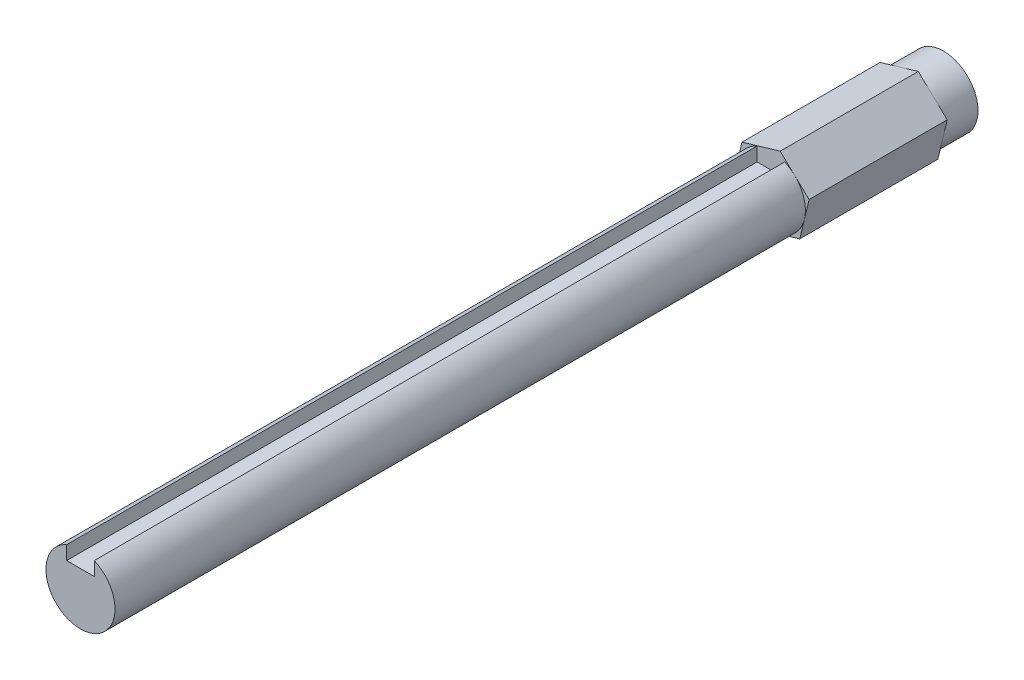
ISO-10303-21;
HEADER;
FILE_DESCRIPTION(('STEP AP214'),'2;1');
FILE_NAME('part.step','',(''),(''),'','','');
FILE_SCHEMA(('AUTOMOTIVE_DESIGN { 1 0 10303 214 1 1 1 1 }'));
ENDSEC;
DATA;
#1=APPLICATION_CONTEXT('core data for automotive mechanical design processes');
#2=APPLICATION_PROTOCOL_DEFINITION('international standard','automotive_design',2000,#1);
#3=PRODUCT_CONTEXT('',#1,'mechanical');
#4=PRODUCT('Part','Part','',(#3));
#5=PRODUCT_RELATED_PRODUCT_CATEGORY('part','',(#4));
#6=PRODUCT_DEFINITION_FORMATION('','',#4);
#7=PRODUCT_DEFINITION_CONTEXT('part definition',#1,'design');
#8=PRODUCT_DEFINITION('design','',#6,#7);
#9=PRODUCT_DEFINITION_SHAPE('','',#8);
#10=(LENGTH_UNIT() NAMED_UNIT(*) SI_UNIT(.MILLI.,.METRE.));
#11=(NAMED_UNIT(*) PLANE_ANGLE_UNIT() SI_UNIT($,.RADIAN.));
#12=(NAMED_UNIT(*) SI_UNIT($,.STERADIAN.) SOLID_ANGLE_UNIT());
#13=UNCERTAINTY_MEASURE_WITH_UNIT(LENGTH_MEASURE(1.E-05),#10,'distance_accuracy_value','');
#14=(GEOMETRIC_REPRESENTATION_CONTEXT(3) GLOBAL_UNCERTAINTY_ASSIGNED_CONTEXT((#13)) GLOBAL_UNIT_ASSIGNED_CONTEXT((#10,
#11,#12)) REPRESENTATION_CONTEXT('',''));
#15=CARTESIAN_POINT('',(0.,0.,0.));
#16=DIRECTION('',(0.,0.,1.));
#17=DIRECTION('',(1.,0.,0.));
#18=AXIS2_PLACEMENT_3D('',#15,#16,#17);
#19=CARTESIAN_POINT('',(0.,0.,20.));
#20=DIRECTION('',(0.,0.,1.));
#21=DIRECTION('',(1.,0.,0.));
#22=AXIS2_PLACEMENT_3D('',#19,#20,#21);
#23=PLANE('',#22);
#24=CARTESIAN_POINT('',(0.,0.,20.));
#25=DIRECTION('',(0.,0.,1.));
#26=DIRECTION('',(1.,0.,0.));
#27=AXIS2_PLACEMENT_3D('',#24,#25,#26);
#28=CIRCLE('',#27,4.99999999999998);
#29=CARTESIAN_POINT('',(-2.,4.58257569495582,20.));
#30=VERTEX_POINT('',#29);
#31=CARTESIAN_POINT('',(-4.8615327041477,1.16854600529981,20.));
#32=VERTEX_POINT('',#31);
#33=EDGE_CURVE('E43',#30,#32,#28,.T.);
#34=ORIENTED_EDGE('',*,*,#33,.F.);
#35=DIRECTION('',(0.,-1.,0.));
#36=VECTOR('',#35,1.);
#37=CARTESIAN_POINT('',(-2.,2.58257569495582,20.));
#38=LINE('',#37,#36);
#39=CARTESIAN_POINT('',(-2.,2.58257569495582,20.));
#40=VERTEX_POINT('',#39);
#41=EDGE_CURVE('E145',#30,#40,#38,.T.);
#42=ORIENTED_EDGE('',*,*,#41,.T.);
#43=DIRECTION('',(1.,0.,0.));
#44=VECTOR('',#43,1.);
#45=CARTESIAN_POINT('',(2.,2.58257569495582,20.));
#46=LINE('',#45,#44);
#47=CARTESIAN_POINT('',(2.,2.58257569495582,20.));
#48=VERTEX_POINT('',#47);
#49=EDGE_CURVE('E149',#40,#48,#46,.T.);
#50=ORIENTED_EDGE('',*,*,#49,.T.);
#51=DIRECTION('',(0.,1.,0.));
#52=VECTOR('',#51,1.);
#53=CARTESIAN_POINT('',(2.,2.58257569495582,20.));
#54=LINE('',#53,#52);
#55=CARTESIAN_POINT('',(2.,4.58257569495582,20.));
#56=VERTEX_POINT('',#55);
#57=EDGE_CURVE('E161',#48,#56,#54,.T.);
#58=ORIENTED_EDGE('',*,*,#57,.T.);
#59=CARTESIAN_POINT('',(3.44275687815431,3.62593782047086,20.));
#60=VERTEX_POINT('',#59);
#61=EDGE_CURVE('E175',#60,#56,#28,.T.);
#62=ORIENTED_EDGE('',*,*,#61,.F.);
#63=DIRECTION('',(-0.725187564094175,0.688551375630865,0.));
#64=VECTOR('',#63,1.);
#65=CARTESIAN_POINT('',(5.53619305486802,1.63826121011403,20.));
#66=LINE('',#65,#64);
#67=CARTESIAN_POINT('',(1.34932070144062,5.6136144308277,20.));
#68=VERTEX_POINT('',#67);
#69=EDGE_CURVE('E193',#60,#68,#66,.T.);
#70=ORIENTED_EDGE('',*,*,#69,.T.);
#71=DIRECTION('',(-0.958896765154138,-0.283755165198678,0.));
#72=VECTOR('',#71,1.);
#73=CARTESIAN_POINT('',(1.34932070144062,5.6136144308277,20.));
#74=LINE('',#73,#72);
#75=CARTESIAN_POINT('',(-4.18687235342739,3.97535322071367,20.));
#76=VERTEX_POINT('',#75);
#77=EDGE_CURVE('E197',#68,#76,#74,.T.);
#78=ORIENTED_EDGE('',*,*,#77,.T.);
#79=DIRECTION('',(-0.233709201059963,-0.972306540829544,0.));
#80=VECTOR('',#79,1.);
#81=CARTESIAN_POINT('',(-4.18687235342739,3.97535322071367,20.));
#82=LINE('',#81,#80);
#83=EDGE_CURVE('E200',#76,#32,#82,.T.);
#84=ORIENTED_EDGE('',*,*,#83,.T.);
#85=EDGE_LOOP('',(#34,#42,#50,#58,#62,#70,#78,#84));
#86=FACE_BOUND('',#85,.T.);
#87=ADVANCED_FACE('F35',(#86),#23,.T.);
#88=CARTESIAN_POINT('',(-3.44275687815431,-3.62593782047086,20.));
#89=VERTEX_POINT('',#88);
#90=EDGE_CURVE('E264',#32,#89,#28,.T.);
#91=ORIENTED_EDGE('',*,*,#90,.F.);
#92=CARTESIAN_POINT('',(-5.53619305486801,-1.63826121011403,20.));
#93=VERTEX_POINT('',#92);
#94=EDGE_CURVE('E199',#32,#93,#82,.T.);
#95=ORIENTED_EDGE('',*,*,#94,.T.);
#96=DIRECTION('',(0.725187564094175,-0.688551375630865,0.));
#97=VECTOR('',#96,1.);
#98=CARTESIAN_POINT('',(-5.53619305486801,-1.63826121011403,20.));
#99=LINE('',#98,#97);
#100=EDGE_CURVE('E203',#93,#89,#99,.T.);
#101=ORIENTED_EDGE('',*,*,#100,.T.);
#102=EDGE_LOOP('',(#91,#95,#101));
#103=FACE_BOUND('',#102,.T.);
#104=ADVANCED_FACE('F271',(#103),#23,.T.);
#105=CARTESIAN_POINT('',(1.41877582599339,-4.79448382577068,20.));
#106=VERTEX_POINT('',#105);
#107=EDGE_CURVE('E262',#89,#106,#28,.T.);
#108=ORIENTED_EDGE('',*,*,#107,.F.);
#109=CARTESIAN_POINT('',(-1.34932070144061,-5.6136144308277,20.));
#110=VERTEX_POINT('',#109);
#111=EDGE_CURVE('E202',#89,#110,#99,.T.);
#112=ORIENTED_EDGE('',*,*,#111,.T.);
#113=DIRECTION('',(0.958896765154138,0.283755165198678,0.));
#114=VECTOR('',#113,1.);
#115=CARTESIAN_POINT('',(-1.34932070144061,-5.6136144308277,20.));
#116=LINE('',#115,#114);
#117=EDGE_CURVE('E207',#110,#106,#116,.T.);
#118=ORIENTED_EDGE('',*,*,#117,.T.);
#119=EDGE_LOOP('',(#108,#112,#118));
#120=FACE_BOUND('',#119,.T.);
#121=ADVANCED_FACE('F312',(#120),#23,.T.);
#122=CARTESIAN_POINT('',(4.86153270414771,-1.16854600529982,20.));
#123=VERTEX_POINT('',#122);
#124=EDGE_CURVE('E57',#106,#123,#28,.T.);
#125=ORIENTED_EDGE('',*,*,#124,.F.);
#126=CARTESIAN_POINT('',(4.18687235342739,-3.97535322071367,20.));
#127=VERTEX_POINT('',#126);
#128=EDGE_CURVE('E206',#106,#127,#116,.T.);
#129=ORIENTED_EDGE('',*,*,#128,.T.);
#130=DIRECTION('',(0.233709201059964,0.972306540829544,0.));
#131=VECTOR('',#130,1.);
#132=CARTESIAN_POINT('',(4.18687235342739,-3.97535322071367,20.));
#133=LINE('',#132,#131);
#134=EDGE_CURVE('E191',#127,#123,#133,.T.);
#135=ORIENTED_EDGE('',*,*,#134,.T.);
#136=EDGE_LOOP('',(#125,#129,#135));
#137=FACE_BOUND('',#136,.T.);
#138=ADVANCED_FACE('F316',(#137),#23,.T.);
#139=CARTESIAN_POINT('',(0.,0.,0.));
#140=DIRECTION('',(0.,0.,1.));
#141=DIRECTION('',(1.,0.,0.));
#142=AXIS2_PLACEMENT_3D('',#139,#140,#141);
#143=PLANE('',#142);
#144=CARTESIAN_POINT('',(0.,0.,0.));
#145=DIRECTION('',(0.,0.,-1.));
#146=DIRECTION('',(-1.,0.,0.));
#147=AXIS2_PLACEMENT_3D('',#144,#145,#146);
#148=CIRCLE('',#147,4.99999999999998);
#149=CARTESIAN_POINT('',(-4.8615327041477,1.16854600529981,0.));
#150=VERTEX_POINT('',#149);
#151=CARTESIAN_POINT('',(-1.41877582599339,4.79448382577068,0.));
#152=VERTEX_POINT('',#151);
#153=EDGE_CURVE('E179',#150,#152,#148,.T.);
#154=ORIENTED_EDGE('',*,*,#153,.F.);
#155=DIRECTION('',(-0.233709201059963,-0.972306540829544,0.));
#156=VECTOR('',#155,1.);
#157=CARTESIAN_POINT('',(-4.18687235342739,3.97535322071367,0.));
#158=LINE('',#157,#156);
#159=CARTESIAN_POINT('',(-4.18687235342739,3.97535322071367,0.));
#160=VERTEX_POINT('',#159);
#161=EDGE_CURVE('E223',#160,#150,#158,.T.);
#162=ORIENTED_EDGE('',*,*,#161,.F.);
#163=DIRECTION('',(-0.958896765154138,-0.283755165198678,0.));
#164=VECTOR('',#163,1.);
#165=CARTESIAN_POINT('',(1.34932070144062,5.6136144308277,0.));
#166=LINE('',#165,#164);
#167=EDGE_CURVE('E218',#152,#160,#166,.T.);
#168=ORIENTED_EDGE('',*,*,#167,.F.);
#169=EDGE_LOOP('',(#154,#162,#168));
#170=FACE_BOUND('',#169,.T.);
#171=ADVANCED_FACE('F289',(#170),#143,.F.);
#172=CARTESIAN_POINT('',(3.44275687815432,3.62593782047086,0.));
#173=VERTEX_POINT('',#172);
#174=EDGE_CURVE('E189',#152,#173,#148,.T.);
#175=ORIENTED_EDGE('',*,*,#174,.F.);
#176=CARTESIAN_POINT('',(1.34932070144062,5.6136144308277,0.));
#177=VERTEX_POINT('',#176);
#178=EDGE_CURVE('E219',#177,#152,#166,.T.);
#179=ORIENTED_EDGE('',*,*,#178,.F.);
#180=DIRECTION('',(-0.725187564094175,0.688551375630865,0.));
#181=VECTOR('',#180,1.);
#182=CARTESIAN_POINT('',(5.53619305486802,1.63826121011403,0.));
#183=LINE('',#182,#181);
#184=EDGE_CURVE('E214',#173,#177,#183,.T.);
#185=ORIENTED_EDGE('',*,*,#184,.F.);
#186=EDGE_LOOP('',(#175,#179,#185));
#187=FACE_BOUND('',#186,.T.);
#188=ADVANCED_FACE('F328',(#187),#143,.F.);
#189=CARTESIAN_POINT('',(4.86153270414771,-1.16854600529982,0.));
#190=VERTEX_POINT('',#189);
#191=EDGE_CURVE('E257',#173,#190,#148,.T.);
#192=ORIENTED_EDGE('',*,*,#191,.F.);
#193=CARTESIAN_POINT('',(5.53619305486802,1.63826121011403,0.));
#194=VERTEX_POINT('',#193);
#195=EDGE_CURVE('E215',#194,#173,#183,.T.);
#196=ORIENTED_EDGE('',*,*,#195,.F.);
#197=DIRECTION('',(0.233709201059964,0.972306540829544,0.));
#198=VECTOR('',#197,1.);
#199=CARTESIAN_POINT('',(4.18687235342739,-3.97535322071367,0.));
#200=LINE('',#199,#198);
#201=EDGE_CURVE('E186',#190,#194,#200,.T.);
#202=ORIENTED_EDGE('',*,*,#201,.F.);
#203=EDGE_LOOP('',(#192,#196,#202));
#204=FACE_BOUND('',#203,.T.);
#205=ADVANCED_FACE('F458',(#204),#143,.F.);
#206=CARTESIAN_POINT('',(1.41877582599339,-4.79448382577068,0.));
#207=VERTEX_POINT('',#206);
#208=EDGE_CURVE('E255',#190,#207,#148,.T.);
#209=ORIENTED_EDGE('',*,*,#208,.F.);
#210=CARTESIAN_POINT('',(4.18687235342739,-3.97535322071367,0.));
#211=VERTEX_POINT('',#210);
#212=EDGE_CURVE('E211',#211,#190,#200,.T.);
#213=ORIENTED_EDGE('',*,*,#212,.F.);
#214=DIRECTION('',(0.958896765154138,0.283755165198678,0.));
#215=VECTOR('',#214,1.);
#216=CARTESIAN_POINT('',(-1.34932070144061,-5.6136144308277,0.));
#217=LINE('',#216,#215);
#218=EDGE_CURVE('E229',#207,#211,#217,.T.);
#219=ORIENTED_EDGE('',*,*,#218,.F.);
#220=EDGE_LOOP('',(#209,#213,#219));
#221=FACE_BOUND('',#220,.T.);
#222=ADVANCED_FACE('F450',(#221),#143,.F.);
#223=CARTESIAN_POINT('',(-3.44275687815431,-3.62593782047086,0.));
#224=VERTEX_POINT('',#223);
#225=EDGE_CURVE('E252',#207,#224,#148,.T.);
#226=ORIENTED_EDGE('',*,*,#225,.F.);
#227=CARTESIAN_POINT('',(-1.34932070144061,-5.6136144308277,0.));
#228=VERTEX_POINT('',#227);
#229=EDGE_CURVE('E230',#228,#207,#217,.T.);
#230=ORIENTED_EDGE('',*,*,#229,.F.);
#231=DIRECTION('',(0.725187564094175,-0.688551375630865,0.));
#232=VECTOR('',#231,1.);
#233=CARTESIAN_POINT('',(-5.53619305486801,-1.63826121011403,0.));
#234=LINE('',#233,#232);
#235=EDGE_CURVE('E225',#224,#228,#234,.T.);
#236=ORIENTED_EDGE('',*,*,#235,.F.);
#237=EDGE_LOOP('',(#226,#230,#236));
#238=FACE_BOUND('',#237,.T.);
#239=ADVANCED_FACE('F305',(#238),#143,.F.);
#240=CARTESIAN_POINT('',(4.18687235342739,-3.97535322071367,20.));
#241=DIRECTION('',(-0.972306540829544,0.233709201059964,0.));
#242=DIRECTION('',(-0.233709201059964,-0.972306540829544,0.));
#243=AXIS2_PLACEMENT_3D('',#240,#241,#242);
#244=PLANE('',#243);
#245=ORIENTED_EDGE('',*,*,#212,.T.);
#246=ORIENTED_EDGE('',*,*,#201,.T.);
#247=DIRECTION('',(0.,0.,-1.));
#248=VECTOR('',#247,1.);
#249=CARTESIAN_POINT('',(5.53619305486802,1.63826121011403,20.));
#250=LINE('',#249,#248);
#251=CARTESIAN_POINT('',(5.53619305486802,1.63826121011403,20.));
#252=VERTEX_POINT('',#251);
#253=EDGE_CURVE('E246',#252,#194,#250,.T.);
#254=ORIENTED_EDGE('',*,*,#253,.F.);
#255=EDGE_CURVE('E194',#123,#252,#133,.T.);
#256=ORIENTED_EDGE('',*,*,#255,.F.);
#257=ORIENTED_EDGE('',*,*,#134,.F.);
#258=DIRECTION('',(0.,0.,-1.));
#259=VECTOR('',#258,1.);
#260=CARTESIAN_POINT('',(4.18687235342739,-3.97535322071367,20.));
#261=LINE('',#260,#259);
#262=EDGE_CURVE('E210',#127,#211,#261,.T.);
#263=ORIENTED_EDGE('',*,*,#262,.T.);
#264=EDGE_LOOP('',(#245,#246,#254,#256,#257,#263));
#265=FACE_BOUND('',#264,.T.);
#266=ADVANCED_FACE('F37',(#265),#244,.F.);
#267=CARTESIAN_POINT('',(5.53619305486802,1.63826121011403,20.));
#268=DIRECTION('',(-0.688551375630865,-0.725187564094175,0.));
#269=DIRECTION('',(0.725187564094175,-0.688551375630866,0.));
#270=AXIS2_PLACEMENT_3D('',#267,#268,#269);
#271=PLANE('',#270);
#272=ORIENTED_EDGE('',*,*,#195,.T.);
#273=ORIENTED_EDGE('',*,*,#184,.T.);
#274=DIRECTION('',(0.,0.,-1.));
#275=VECTOR('',#274,1.);
#276=CARTESIAN_POINT('',(1.34932070144062,5.6136144308277,20.));
#277=LINE('',#276,#275);
#278=EDGE_CURVE('E244',#68,#177,#277,.T.);
#279=ORIENTED_EDGE('',*,*,#278,.F.);
#280=ORIENTED_EDGE('',*,*,#69,.F.);
#281=EDGE_CURVE('E195',#252,#60,#66,.T.);
#282=ORIENTED_EDGE('',*,*,#281,.F.);
#283=ORIENTED_EDGE('',*,*,#253,.T.);
#284=EDGE_LOOP('',(#272,#273,#279,#280,#282,#283));
#285=FACE_BOUND('',#284,.T.);
#286=ADVANCED_FACE('F343',(#285),#271,.F.);
#287=CARTESIAN_POINT('',(1.34932070144062,5.6136144308277,20.));
#288=DIRECTION('',(0.283755165198678,-0.958896765154139,0.));
#289=DIRECTION('',(0.958896765154139,0.283755165198678,0.));
#290=AXIS2_PLACEMENT_3D('',#287,#288,#289);
#291=PLANE('',#290);
#292=ORIENTED_EDGE('',*,*,#178,.T.);
#293=ORIENTED_EDGE('',*,*,#167,.T.);
#294=DIRECTION('',(0.,0.,-1.));
#295=VECTOR('',#294,1.);
#296=CARTESIAN_POINT('',(-4.18687235342739,3.97535322071367,20.));
#297=LINE('',#296,#295);
#298=EDGE_CURVE('E241',#76,#160,#297,.T.);
#299=ORIENTED_EDGE('',*,*,#298,.F.);
#300=ORIENTED_EDGE('',*,*,#77,.F.);
#301=ORIENTED_EDGE('',*,*,#278,.T.);
#302=EDGE_LOOP('',(#292,#293,#299,#300,#301));
#303=FACE_BOUND('',#302,.T.);
#304=ADVANCED_FACE('F283',(#303),#291,.F.);
#305=CARTESIAN_POINT('',(-4.18687235342739,3.97535322071367,20.));
#306=DIRECTION('',(0.972306540829544,-0.233709201059963,0.));
#307=DIRECTION('',(0.233709201059964,0.972306540829544,0.));
#308=AXIS2_PLACEMENT_3D('',#305,#306,#307);
#309=PLANE('',#308);
#310=ORIENTED_EDGE('',*,*,#161,.T.);
#311=CARTESIAN_POINT('',(-5.53619305486801,-1.63826121011403,0.));
#312=VERTEX_POINT('',#311);
#313=EDGE_CURVE('E222',#150,#312,#158,.T.);
#314=ORIENTED_EDGE('',*,*,#313,.T.);
#315=DIRECTION('',(0.,0.,-1.));
#316=VECTOR('',#315,1.);
#317=CARTESIAN_POINT('',(-5.53619305486801,-1.63826121011403,20.));
#318=LINE('',#317,#316);
#319=EDGE_CURVE('E238',#93,#312,#318,.T.);
#320=ORIENTED_EDGE('',*,*,#319,.F.);
#321=ORIENTED_EDGE('',*,*,#94,.F.);
#322=ORIENTED_EDGE('',*,*,#83,.F.);
#323=ORIENTED_EDGE('',*,*,#298,.T.);
#324=EDGE_LOOP('',(#310,#314,#320,#321,#322,#323));
#325=FACE_BOUND('',#324,.T.);
#326=ADVANCED_FACE('F276',(#325),#309,.F.);
#327=CARTESIAN_POINT('',(-5.53619305486801,-1.63826121011403,20.));
#328=DIRECTION('',(0.688551375630865,0.725187564094175,0.));
#329=DIRECTION('',(-0.725187564094175,0.688551375630865,0.));
#330=AXIS2_PLACEMENT_3D('',#327,#328,#329);
#331=PLANE('',#330);
#332=EDGE_CURVE('E226',#312,#224,#234,.T.);
#333=ORIENTED_EDGE('',*,*,#332,.T.);
#334=ORIENTED_EDGE('',*,*,#235,.T.);
#335=DIRECTION('',(0.,0.,-1.));
#336=VECTOR('',#335,1.);
#337=CARTESIAN_POINT('',(-1.34932070144061,-5.6136144308277,20.));
#338=LINE('',#337,#336);
#339=EDGE_CURVE('E235',#110,#228,#338,.T.);
#340=ORIENTED_EDGE('',*,*,#339,.F.);
#341=ORIENTED_EDGE('',*,*,#111,.F.);
#342=ORIENTED_EDGE('',*,*,#100,.F.);
#343=ORIENTED_EDGE('',*,*,#319,.T.);
#344=EDGE_LOOP('',(#333,#334,#340,#341,#342,#343));
#345=FACE_BOUND('',#344,.T.);
#346=ADVANCED_FACE('F320',(#345),#331,.F.);
#347=CARTESIAN_POINT('',(-1.34932070144061,-5.6136144308277,20.));
#348=DIRECTION('',(-0.283755165198678,0.958896765154138,0.));
#349=DIRECTION('',(-0.958896765154139,-0.283755165198678,0.));
#350=AXIS2_PLACEMENT_3D('',#347,#348,#349);
#351=PLANE('',#350);
#352=ORIENTED_EDGE('',*,*,#229,.T.);
#353=ORIENTED_EDGE('',*,*,#218,.T.);
#354=ORIENTED_EDGE('',*,*,#262,.F.);
#355=ORIENTED_EDGE('',*,*,#128,.F.);
#356=ORIENTED_EDGE('',*,*,#117,.F.);
#357=ORIENTED_EDGE('',*,*,#339,.T.);
#358=EDGE_LOOP('',(#352,#353,#354,#355,#356,#357));
#359=FACE_BOUND('',#358,.T.);
#360=ADVANCED_FACE('F314',(#359),#351,.F.);
#361=EDGE_CURVE('E182',#123,#60,#28,.T.);
#362=ORIENTED_EDGE('',*,*,#361,.F.);
#363=ORIENTED_EDGE('',*,*,#255,.T.);
#364=ORIENTED_EDGE('',*,*,#281,.T.);
#365=EDGE_LOOP('',(#362,#363,#364));
#366=FACE_BOUND('',#365,.T.);
#367=ADVANCED_FACE('F302',(#366),#23,.T.);
#368=EDGE_CURVE('E190',#224,#150,#148,.T.);
#369=ORIENTED_EDGE('',*,*,#368,.F.);
#370=ORIENTED_EDGE('',*,*,#332,.F.);
#371=ORIENTED_EDGE('',*,*,#313,.F.);
#372=EDGE_LOOP('',(#369,#370,#371));
#373=FACE_BOUND('',#372,.T.);
#374=ADVANCED_FACE('F293',(#373),#143,.F.);
#375=CARTESIAN_POINT('',(0.,0.,-5.));
#376=DIRECTION('',(0.,0.,1.));
#377=DIRECTION('',(1.,0.,0.));
#378=AXIS2_PLACEMENT_3D('',#375,#376,#377);
#379=CYLINDRICAL_SURFACE('',#378,4.99999999999998);
#380=CARTESIAN_POINT('',(0.,0.,-5.));
#381=DIRECTION('',(0.,0.,-1.));
#382=DIRECTION('',(-1.,0.,0.));
#383=AXIS2_PLACEMENT_3D('',#380,#381,#382);
#384=CIRCLE('',#383,4.99999999999998);
#385=CARTESIAN_POINT('',(-4.99999999999998,0.,-5.));
#386=VERTEX_POINT('',#385);
#387=EDGE_CURVE('E183',#386,#386,#384,.T.);
#388=ORIENTED_EDGE('',*,*,#387,.F.);
#389=EDGE_LOOP('',(#388));
#390=FACE_BOUND('',#389,.T.);
#391=ORIENTED_EDGE('',*,*,#153,.T.);
#392=ORIENTED_EDGE('',*,*,#174,.T.);
#393=ORIENTED_EDGE('',*,*,#191,.T.);
#394=ORIENTED_EDGE('',*,*,#208,.T.);
#395=ORIENTED_EDGE('',*,*,#225,.T.);
#396=ORIENTED_EDGE('',*,*,#368,.T.);
#397=EDGE_LOOP('',(#391,#392,#393,#394,#395,#396));
#398=FACE_BOUND('',#397,.T.);
#399=ADVANCED_FACE('F290',(#390,#398),#379,.T.);
#400=CARTESIAN_POINT('',(0.,0.,-5.));
#401=DIRECTION('',(0.,0.,-1.));
#402=DIRECTION('',(-1.,0.,0.));
#403=AXIS2_PLACEMENT_3D('',#400,#401,#402);
#404=PLANE('',#403);
#405=ORIENTED_EDGE('',*,*,#387,.T.);
#406=EDGE_LOOP('',(#405));
#407=FACE_BOUND('',#406,.T.);
#408=ADVANCED_FACE('F292',(#407),#404,.T.);
#409=CARTESIAN_POINT('',(0.,0.,120.));
#410=DIRECTION('',(0.,0.,-1.));
#411=DIRECTION('',(-1.,0.,0.));
#412=AXIS2_PLACEMENT_3D('',#409,#410,#411);
#413=CYLINDRICAL_SURFACE('',#412,4.99999999999998);
#414=ORIENTED_EDGE('',*,*,#61,.T.);
#415=DIRECTION('',(0.,0.,-1.));
#416=VECTOR('',#415,1.);
#417=CARTESIAN_POINT('',(2.,4.58257569495582,120.));
#418=LINE('',#417,#416);
#419=CARTESIAN_POINT('',(2.,4.58257569495582,120.));
#420=VERTEX_POINT('',#419);
#421=EDGE_CURVE('E172',#56,#420,#418,.F.);
#422=ORIENTED_EDGE('',*,*,#421,.T.);
#423=CARTESIAN_POINT('',(0.,0.,120.));
#424=DIRECTION('',(0.,0.,1.));
#425=DIRECTION('',(1.,0.,0.));
#426=AXIS2_PLACEMENT_3D('',#423,#424,#425);
#427=CIRCLE('',#426,4.99999999999998);
#428=CARTESIAN_POINT('',(-2.,4.58257569495582,120.));
#429=VERTEX_POINT('',#428);
#430=EDGE_CURVE('E176',#429,#420,#427,.T.);
#431=ORIENTED_EDGE('',*,*,#430,.F.);
#432=DIRECTION('',(0.,0.,-1.));
#433=VECTOR('',#432,1.);
#434=CARTESIAN_POINT('',(-2.,4.58257569495582,120.));
#435=LINE('',#434,#433);
#436=EDGE_CURVE('E49',#429,#30,#435,.T.);
#437=ORIENTED_EDGE('',*,*,#436,.T.);
#438=ORIENTED_EDGE('',*,*,#33,.T.);
#439=ORIENTED_EDGE('',*,*,#90,.T.);
#440=ORIENTED_EDGE('',*,*,#107,.T.);
#441=ORIENTED_EDGE('',*,*,#124,.T.);
#442=ORIENTED_EDGE('',*,*,#361,.T.);
#443=EDGE_LOOP('',(#414,#422,#431,#437,#438,#439,#440,#441,#442));
#444=FACE_BOUND('',#443,.T.);
#445=ADVANCED_FACE('F267',(#444),#413,.T.);
#446=CARTESIAN_POINT('',(0.,0.,120.));
#447=DIRECTION('',(0.,0.,1.));
#448=DIRECTION('',(1.,0.,0.));
#449=AXIS2_PLACEMENT_3D('',#446,#447,#448);
#450=PLANE('',#449);
#451=DIRECTION('',(0.,1.,0.));
#452=VECTOR('',#451,1.);
#453=CARTESIAN_POINT('',(2.,2.58257569495582,120.));
#454=LINE('',#453,#452);
#455=CARTESIAN_POINT('',(2.,2.58257569495582,120.));
#456=VERTEX_POINT('',#455);
#457=EDGE_CURVE('E152',#456,#420,#454,.T.);
#458=ORIENTED_EDGE('',*,*,#457,.F.);
#459=DIRECTION('',(1.,0.,0.));
#460=VECTOR('',#459,1.);
#461=CARTESIAN_POINT('',(2.,2.58257569495582,120.));
#462=LINE('',#461,#460);
#463=CARTESIAN_POINT('',(-2.,2.58257569495582,120.));
#464=VERTEX_POINT('',#463);
#465=EDGE_CURVE('E167',#464,#456,#462,.T.);
#466=ORIENTED_EDGE('',*,*,#465,.F.);
#467=DIRECTION('',(0.,-1.,0.));
#468=VECTOR('',#467,1.);
#469=CARTESIAN_POINT('',(-2.,0.,120.));
#470=LINE('',#469,#468);
#471=EDGE_CURVE('E11',#429,#464,#470,.T.);
#472=ORIENTED_EDGE('',*,*,#471,.F.);
#473=ORIENTED_EDGE('',*,*,#430,.T.);
#474=EDGE_LOOP('',(#458,#466,#472,#473));
#475=FACE_BOUND('',#474,.T.);
#476=ADVANCED_FACE('F347',(#475),#450,.T.);
#477=CARTESIAN_POINT('',(2.,2.58257569495582,20.));
#478=DIRECTION('',(1.,0.,0.));
#479=DIRECTION('',(0.,1.,0.));
#480=AXIS2_PLACEMENT_3D('',#477,#478,#479);
#481=PLANE('',#480);
#482=ORIENTED_EDGE('',*,*,#57,.F.);
#483=DIRECTION('',(0.,0.,1.));
#484=VECTOR('',#483,1.);
#485=CARTESIAN_POINT('',(2.,2.58257569495582,20.));
#486=LINE('',#485,#484);
#487=EDGE_CURVE('E160',#48,#456,#486,.T.);
#488=ORIENTED_EDGE('',*,*,#487,.T.);
#489=ORIENTED_EDGE('',*,*,#457,.T.);
#490=ORIENTED_EDGE('',*,*,#421,.F.);
#491=EDGE_LOOP('',(#482,#488,#489,#490));
#492=FACE_BOUND('',#491,.T.);
#493=ADVANCED_FACE('F348',(#492),#481,.F.);
#494=CARTESIAN_POINT('',(-2.,2.58257569495582,20.));
#495=DIRECTION('',(-1.,0.,0.));
#496=DIRECTION('',(0.,-1.,0.));
#497=AXIS2_PLACEMENT_3D('',#494,#495,#496);
#498=PLANE('',#497);
#499=ORIENTED_EDGE('',*,*,#471,.T.);
#500=DIRECTION('',(0.,0.,1.));
#501=VECTOR('',#500,1.);
#502=CARTESIAN_POINT('',(-2.,2.58257569495582,20.));
#503=LINE('',#502,#501);
#504=EDGE_CURVE('E155',#40,#464,#503,.T.);
#505=ORIENTED_EDGE('',*,*,#504,.F.);
#506=ORIENTED_EDGE('',*,*,#41,.F.);
#507=ORIENTED_EDGE('',*,*,#436,.F.);
#508=EDGE_LOOP('',(#499,#505,#506,#507));
#509=FACE_BOUND('',#508,.T.);
#510=ADVANCED_FACE('F156',(#509),#498,.F.);
#511=CARTESIAN_POINT('',(2.,2.58257569495582,20.));
#512=DIRECTION('',(0.,-1.,0.));
#513=DIRECTION('',(0.,0.,-1.));
#514=AXIS2_PLACEMENT_3D('',#511,#512,#513);
#515=PLANE('',#514);
#516=ORIENTED_EDGE('',*,*,#465,.T.);
#517=ORIENTED_EDGE('',*,*,#487,.F.);
#518=ORIENTED_EDGE('',*,*,#49,.F.);
#519=ORIENTED_EDGE('',*,*,#504,.T.);
#520=EDGE_LOOP('',(#516,#517,#518,#519));
#521=FACE_BOUND('',#520,.T.);
#522=ADVANCED_FACE('F163',(#521),#515,.F.);
#523=CLOSED_SHELL('',(#87,#104,#121,#138,#171,#188,#205,#222,#239,#266,#286,#304,#326,#346,#360,
#367,#374,#399,#408,#445,#476,#493,#510,#522));
#524=MANIFOLD_SOLID_BREP('B2',#523);
#525=ADVANCED_BREP_SHAPE_REPRESENTATION('',(#18,#524),#14);
#526=SHAPE_DEFINITION_REPRESENTATION(#9,#525);
ENDSEC;
END-ISO-10303-21;
